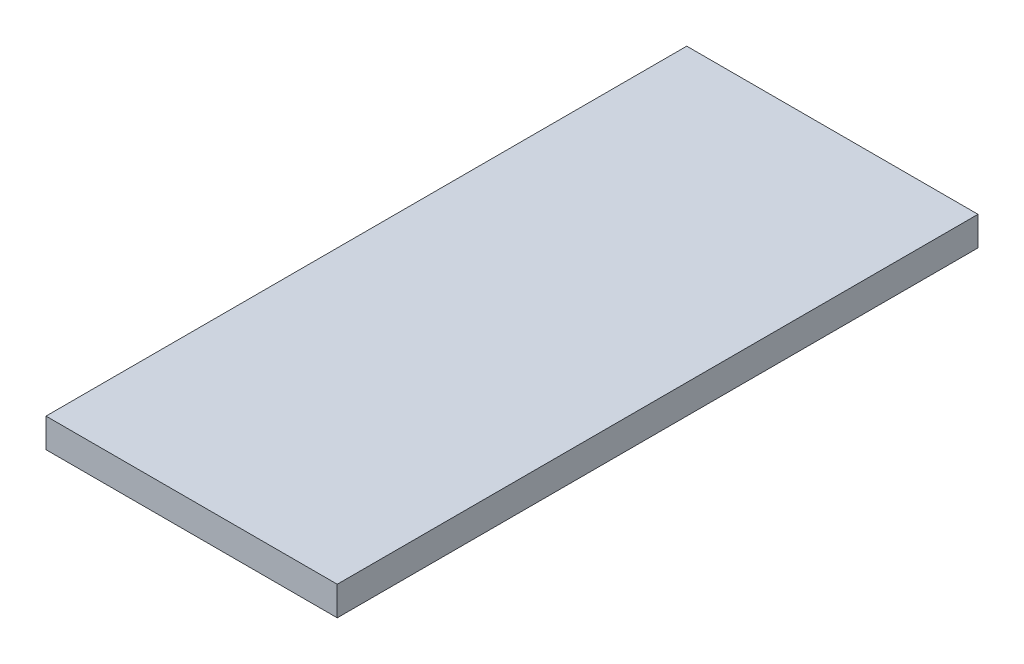
ISO-10303-21;
HEADER;
FILE_DESCRIPTION(('STEP AP214'),'2;1');
FILE_NAME('part.step','',(''),(''),'','','');
FILE_SCHEMA(('AUTOMOTIVE_DESIGN { 1 0 10303 214 1 1 1 1 }'));
ENDSEC;
DATA;
#1=APPLICATION_CONTEXT('core data for automotive mechanical design processes');
#2=APPLICATION_PROTOCOL_DEFINITION('international standard','automotive_design',2000,#1);
#3=PRODUCT_CONTEXT('',#1,'mechanical');
#4=PRODUCT('Part','Part','',(#3));
#5=PRODUCT_RELATED_PRODUCT_CATEGORY('part','',(#4));
#6=PRODUCT_DEFINITION_FORMATION('','',#4);
#7=PRODUCT_DEFINITION_CONTEXT('part definition',#1,'design');
#8=PRODUCT_DEFINITION('design','',#6,#7);
#9=PRODUCT_DEFINITION_SHAPE('','',#8);
#10=(LENGTH_UNIT() NAMED_UNIT(*) SI_UNIT(.MILLI.,.METRE.));
#11=(NAMED_UNIT(*) PLANE_ANGLE_UNIT() SI_UNIT($,.RADIAN.));
#12=(NAMED_UNIT(*) SI_UNIT($,.STERADIAN.) SOLID_ANGLE_UNIT());
#13=UNCERTAINTY_MEASURE_WITH_UNIT(LENGTH_MEASURE(1.E-05),#10,'distance_accuracy_value','');
#14=(GEOMETRIC_REPRESENTATION_CONTEXT(3) GLOBAL_UNCERTAINTY_ASSIGNED_CONTEXT((#13)) GLOBAL_UNIT_ASSIGNED_CONTEXT((#10,
#11,#12)) REPRESENTATION_CONTEXT('',''));
#15=CARTESIAN_POINT('',(0.,0.,0.));
#16=DIRECTION('',(0.,0.,1.));
#17=DIRECTION('',(1.,0.,0.));
#18=AXIS2_PLACEMENT_3D('',#15,#16,#17);
#19=CARTESIAN_POINT('',(0.,1.,0.));
#20=DIRECTION('',(1.,0.,0.));
#21=DIRECTION('',(0.,0.,-1.));
#22=AXIS2_PLACEMENT_3D('',#19,#20,#21);
#23=PLANE('',#22);
#24=DIRECTION('',(0.,0.,1.));
#25=VECTOR('',#24,1.);
#26=CARTESIAN_POINT('',(0.,0.,0.));
#27=LINE('',#26,#25);
#28=CARTESIAN_POINT('',(0.,0.,0.));
#29=VERTEX_POINT('',#28);
#30=CARTESIAN_POINT('',(0.,0.,22.));
#31=VERTEX_POINT('',#30);
#32=EDGE_CURVE('E100',#29,#31,#27,.T.);
#33=ORIENTED_EDGE('',*,*,#32,.T.);
#34=DIRECTION('',(0.,-1.,0.));
#35=VECTOR('',#34,1.);
#36=CARTESIAN_POINT('',(0.,1.,22.));
#37=LINE('',#36,#35);
#38=CARTESIAN_POINT('',(0.,1.,22.));
#39=VERTEX_POINT('',#38);
#40=EDGE_CURVE('E11',#39,#31,#37,.T.);
#41=ORIENTED_EDGE('',*,*,#40,.F.);
#42=DIRECTION('',(0.,0.,1.));
#43=VECTOR('',#42,1.);
#44=CARTESIAN_POINT('',(0.,1.,0.));
#45=LINE('',#44,#43);
#46=CARTESIAN_POINT('',(0.,1.,0.));
#47=VERTEX_POINT('',#46);
#48=EDGE_CURVE('E88',#47,#39,#45,.T.);
#49=ORIENTED_EDGE('',*,*,#48,.F.);
#50=DIRECTION('',(0.,-1.,0.));
#51=VECTOR('',#50,1.);
#52=CARTESIAN_POINT('',(0.,1.,0.));
#53=LINE('',#52,#51);
#54=EDGE_CURVE('E96',#47,#29,#53,.T.);
#55=ORIENTED_EDGE('',*,*,#54,.T.);
#56=EDGE_LOOP('',(#33,#41,#49,#55));
#57=FACE_BOUND('',#56,.T.);
#58=ADVANCED_FACE('F37',(#57),#23,.F.);
#59=CARTESIAN_POINT('',(0.,1.,22.));
#60=DIRECTION('',(0.,0.,-1.));
#61=DIRECTION('',(-1.,0.,0.));
#62=AXIS2_PLACEMENT_3D('',#59,#60,#61);
#63=PLANE('',#62);
#64=DIRECTION('',(1.,0.,0.));
#65=VECTOR('',#64,1.);
#66=CARTESIAN_POINT('',(0.,0.,22.));
#67=LINE('',#66,#65);
#68=CARTESIAN_POINT('',(10.,0.,22.));
#69=VERTEX_POINT('',#68);
#70=EDGE_CURVE('E92',#31,#69,#67,.T.);
#71=ORIENTED_EDGE('',*,*,#70,.T.);
#72=DIRECTION('',(0.,-1.,0.));
#73=VECTOR('',#72,1.);
#74=CARTESIAN_POINT('',(10.,1.,22.));
#75=LINE('',#74,#73);
#76=CARTESIAN_POINT('',(10.,1.,22.));
#77=VERTEX_POINT('',#76);
#78=EDGE_CURVE('E45',#77,#69,#75,.T.);
#79=ORIENTED_EDGE('',*,*,#78,.F.);
#80=DIRECTION('',(1.,0.,0.));
#81=VECTOR('',#80,1.);
#82=CARTESIAN_POINT('',(0.,1.,22.));
#83=LINE('',#82,#81);
#84=EDGE_CURVE('E83',#39,#77,#83,.T.);
#85=ORIENTED_EDGE('',*,*,#84,.F.);
#86=ORIENTED_EDGE('',*,*,#40,.T.);
#87=EDGE_LOOP('',(#71,#79,#85,#86));
#88=FACE_BOUND('',#87,.T.);
#89=ADVANCED_FACE('F91',(#88),#63,.F.);
#90=CARTESIAN_POINT('',(10.,1.,0.));
#91=DIRECTION('',(-1.,0.,0.));
#92=DIRECTION('',(0.,0.,1.));
#93=AXIS2_PLACEMENT_3D('',#90,#91,#92);
#94=PLANE('',#93);
#95=DIRECTION('',(0.,0.,-1.));
#96=VECTOR('',#95,1.);
#97=CARTESIAN_POINT('',(10.,0.,0.));
#98=LINE('',#97,#96);
#99=CARTESIAN_POINT('',(10.,0.,0.));
#100=VERTEX_POINT('',#99);
#101=EDGE_CURVE('E70',#69,#100,#98,.T.);
#102=ORIENTED_EDGE('',*,*,#101,.T.);
#103=DIRECTION('',(0.,-1.,0.));
#104=VECTOR('',#103,1.);
#105=CARTESIAN_POINT('',(10.,1.,0.));
#106=LINE('',#105,#104);
#107=CARTESIAN_POINT('',(10.,1.,0.));
#108=VERTEX_POINT('',#107);
#109=EDGE_CURVE('E93',#108,#100,#106,.T.);
#110=ORIENTED_EDGE('',*,*,#109,.F.);
#111=DIRECTION('',(0.,0.,-1.));
#112=VECTOR('',#111,1.);
#113=CARTESIAN_POINT('',(10.,1.,0.));
#114=LINE('',#113,#112);
#115=EDGE_CURVE('E86',#77,#108,#114,.T.);
#116=ORIENTED_EDGE('',*,*,#115,.F.);
#117=ORIENTED_EDGE('',*,*,#78,.T.);
#118=EDGE_LOOP('',(#102,#110,#116,#117));
#119=FACE_BOUND('',#118,.T.);
#120=ADVANCED_FACE('F94',(#119),#94,.F.);
#121=CARTESIAN_POINT('',(0.,1.,0.));
#122=DIRECTION('',(0.,0.,1.));
#123=DIRECTION('',(1.,0.,0.));
#124=AXIS2_PLACEMENT_3D('',#121,#122,#123);
#125=PLANE('',#124);
#126=DIRECTION('',(-1.,0.,0.));
#127=VECTOR('',#126,1.);
#128=CARTESIAN_POINT('',(0.,0.,0.));
#129=LINE('',#128,#127);
#130=EDGE_CURVE('E76',#100,#29,#129,.T.);
#131=ORIENTED_EDGE('',*,*,#130,.T.);
#132=ORIENTED_EDGE('',*,*,#54,.F.);
#133=DIRECTION('',(-1.,0.,0.));
#134=VECTOR('',#133,1.);
#135=CARTESIAN_POINT('',(0.,1.,0.));
#136=LINE('',#135,#134);
#137=EDGE_CURVE('E53',#108,#47,#136,.T.);
#138=ORIENTED_EDGE('',*,*,#137,.F.);
#139=ORIENTED_EDGE('',*,*,#109,.T.);
#140=EDGE_LOOP('',(#131,#132,#138,#139));
#141=FACE_BOUND('',#140,.T.);
#142=ADVANCED_FACE('F107',(#141),#125,.F.);
#143=CARTESIAN_POINT('',(0.,1.,0.));
#144=DIRECTION('',(0.,1.,0.));
#145=DIRECTION('',(0.,0.,1.));
#146=AXIS2_PLACEMENT_3D('',#143,#144,#145);
#147=PLANE('',#146);
#148=ORIENTED_EDGE('',*,*,#48,.T.);
#149=ORIENTED_EDGE('',*,*,#84,.T.);
#150=ORIENTED_EDGE('',*,*,#115,.T.);
#151=ORIENTED_EDGE('',*,*,#137,.T.);
#152=EDGE_LOOP('',(#148,#149,#150,#151));
#153=FACE_BOUND('',#152,.T.);
#154=ADVANCED_FACE('F84',(#153),#147,.T.);
#155=CARTESIAN_POINT('',(0.,0.,0.));
#156=DIRECTION('',(0.,1.,0.));
#157=DIRECTION('',(0.,0.,1.));
#158=AXIS2_PLACEMENT_3D('',#155,#156,#157);
#159=PLANE('',#158);
#160=ORIENTED_EDGE('',*,*,#32,.F.);
#161=ORIENTED_EDGE('',*,*,#130,.F.);
#162=ORIENTED_EDGE('',*,*,#101,.F.);
#163=ORIENTED_EDGE('',*,*,#70,.F.);
#164=EDGE_LOOP('',(#160,#161,#162,#163));
#165=FACE_BOUND('',#164,.T.);
#166=ADVANCED_FACE('F110',(#165),#159,.F.);
#167=CLOSED_SHELL('',(#58,#89,#120,#142,#154,#166));
#168=MANIFOLD_SOLID_BREP('B2',#167);
#169=ADVANCED_BREP_SHAPE_REPRESENTATION('',(#18,#168),#14);
#170=SHAPE_DEFINITION_REPRESENTATION(#9,#169);
ENDSEC;
END-ISO-10303-21;
